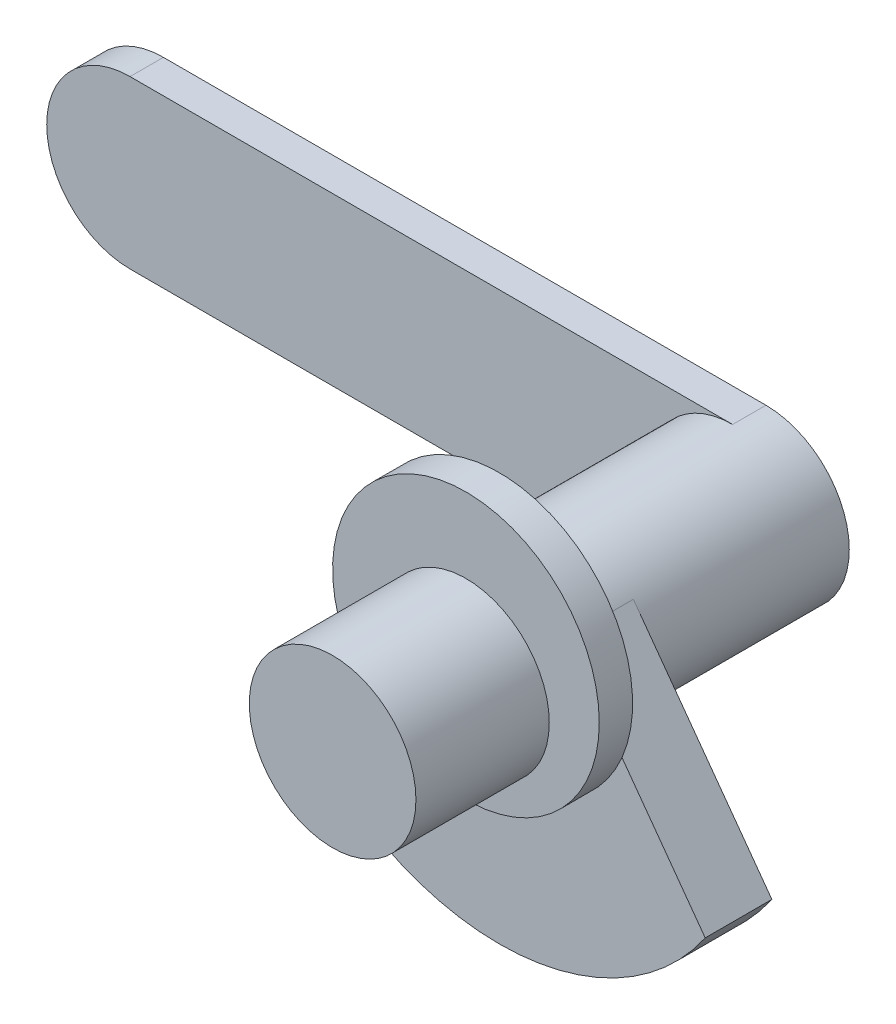
ISO-10303-21;
HEADER;
FILE_DESCRIPTION(('STEP AP214'),'2;1');
FILE_NAME('part.step','',(''),(''),'','','');
FILE_SCHEMA(('AUTOMOTIVE_DESIGN { 1 0 10303 214 1 1 1 1 }'));
ENDSEC;
DATA;
#1=APPLICATION_CONTEXT('core data for automotive mechanical design processes');
#2=APPLICATION_PROTOCOL_DEFINITION('international standard','automotive_design',2000,#1);
#3=PRODUCT_CONTEXT('',#1,'mechanical');
#4=PRODUCT('Part','Part','',(#3));
#5=PRODUCT_RELATED_PRODUCT_CATEGORY('part','',(#4));
#6=PRODUCT_DEFINITION_FORMATION('','',#4);
#7=PRODUCT_DEFINITION_CONTEXT('part definition',#1,'design');
#8=PRODUCT_DEFINITION('design','',#6,#7);
#9=PRODUCT_DEFINITION_SHAPE('','',#8);
#10=(LENGTH_UNIT() NAMED_UNIT(*) SI_UNIT(.MILLI.,.METRE.));
#11=(NAMED_UNIT(*) PLANE_ANGLE_UNIT() SI_UNIT($,.RADIAN.));
#12=(NAMED_UNIT(*) SI_UNIT($,.STERADIAN.) SOLID_ANGLE_UNIT());
#13=UNCERTAINTY_MEASURE_WITH_UNIT(LENGTH_MEASURE(1.E-05),#10,'distance_accuracy_value','');
#14=(GEOMETRIC_REPRESENTATION_CONTEXT(3) GLOBAL_UNCERTAINTY_ASSIGNED_CONTEXT((#13)) GLOBAL_UNIT_ASSIGNED_CONTEXT((#10,
#11,#12)) REPRESENTATION_CONTEXT('',''));
#15=CARTESIAN_POINT('',(0.,0.,0.));
#16=DIRECTION('',(0.,0.,1.));
#17=DIRECTION('',(1.,0.,0.));
#18=AXIS2_PLACEMENT_3D('',#15,#16,#17);
#19=CARTESIAN_POINT('',(0.,0.,25.4));
#20=DIRECTION('',(0.,0.,-1.));
#21=DIRECTION('',(-1.,0.,0.));
#22=AXIS2_PLACEMENT_3D('',#19,#20,#21);
#23=PLANE('',#22);
#24=CARTESIAN_POINT('',(0.,0.,25.4));
#25=DIRECTION('',(0.,0.,1.));
#26=DIRECTION('',(1.,0.,0.));
#27=AXIS2_PLACEMENT_3D('',#24,#25,#26);
#28=CIRCLE('',#27,63.5);
#29=CARTESIAN_POINT('',(0.,63.5,25.4));
#30=VERTEX_POINT('',#29);
#31=CARTESIAN_POINT('',(0.,-63.5,25.4));
#32=VERTEX_POINT('',#31);
#33=EDGE_CURVE('E184',#30,#32,#28,.T.);
#34=ORIENTED_EDGE('',*,*,#33,.F.);
#35=DIRECTION('',(-1.,0.,0.));
#36=VECTOR('',#35,1.);
#37=CARTESIAN_POINT('',(0.,63.5,25.4));
#38=LINE('',#37,#36);
#39=CARTESIAN_POINT('',(-459.135608438131,63.5,25.4));
#40=VERTEX_POINT('',#39);
#41=EDGE_CURVE('E198',#30,#40,#38,.T.);
#42=ORIENTED_EDGE('',*,*,#41,.T.);
#43=CARTESIAN_POINT('',(-459.135608438131,0.,25.4));
#44=DIRECTION('',(0.,0.,1.));
#45=DIRECTION('',(1.,0.,0.));
#46=AXIS2_PLACEMENT_3D('',#43,#44,#45);
#47=CIRCLE('',#46,63.5);
#48=CARTESIAN_POINT('',(-459.135608438131,-63.5,25.4));
#49=VERTEX_POINT('',#48);
#50=EDGE_CURVE('E194',#40,#49,#47,.T.);
#51=ORIENTED_EDGE('',*,*,#50,.T.);
#52=DIRECTION('',(-1.,0.,0.));
#53=VECTOR('',#52,1.);
#54=CARTESIAN_POINT('',(0.,-63.5,25.4));
#55=LINE('',#54,#53);
#56=EDGE_CURVE('E190',#32,#49,#55,.T.);
#57=ORIENTED_EDGE('',*,*,#56,.F.);
#58=EDGE_LOOP('',(#34,#42,#51,#57));
#59=FACE_BOUND('',#58,.T.);
#60=ADVANCED_FACE('F45',(#59),#23,.F.);
#61=CARTESIAN_POINT('',(0.,0.,25.4));
#62=DIRECTION('',(0.,0.,-1.));
#63=DIRECTION('',(-1.,0.,0.));
#64=AXIS2_PLACEMENT_3D('',#61,#62,#63);
#65=CYLINDRICAL_SURFACE('',#64,63.5);
#66=CARTESIAN_POINT('',(0.,0.,0.));
#67=DIRECTION('',(0.,0.,-1.));
#68=DIRECTION('',(-1.,0.,0.));
#69=AXIS2_PLACEMENT_3D('',#66,#67,#68);
#70=CIRCLE('',#69,63.5);
#71=CARTESIAN_POINT('',(0.,63.5,0.));
#72=VERTEX_POINT('',#71);
#73=CARTESIAN_POINT('',(0.,-63.5,0.));
#74=VERTEX_POINT('',#73);
#75=EDGE_CURVE('E187',#72,#74,#70,.T.);
#76=ORIENTED_EDGE('',*,*,#75,.F.);
#77=DIRECTION('',(0.,0.,-1.));
#78=VECTOR('',#77,1.);
#79=CARTESIAN_POINT('',(0.,63.5,25.4));
#80=LINE('',#79,#78);
#81=EDGE_CURVE('E55',#30,#72,#80,.T.);
#82=ORIENTED_EDGE('',*,*,#81,.F.);
#83=ORIENTED_EDGE('',*,*,#33,.T.);
#84=DIRECTION('',(0.,0.,-1.));
#85=VECTOR('',#84,1.);
#86=CARTESIAN_POINT('',(0.,-63.5,25.4));
#87=LINE('',#86,#85);
#88=EDGE_CURVE('E49',#32,#74,#87,.T.);
#89=ORIENTED_EDGE('',*,*,#88,.T.);
#90=EDGE_LOOP('',(#76,#82,#83,#89));
#91=FACE_BOUND('',#90,.T.);
#92=CARTESIAN_POINT('',(0.,0.,152.4));
#93=DIRECTION('',(0.,0.,1.));
#94=DIRECTION('',(1.,0.,0.));
#95=AXIS2_PLACEMENT_3D('',#92,#93,#94);
#96=CIRCLE('',#95,63.5);
#97=CARTESIAN_POINT('',(-51.3725791428091,37.3243635205721,152.4));
#98=VERTEX_POINT('',#97);
#99=CARTESIAN_POINT('',(51.3725791428091,37.3243635205721,152.4));
#100=VERTEX_POINT('',#99);
#101=EDGE_CURVE('E71',#98,#100,#96,.T.);
#102=ORIENTED_EDGE('',*,*,#101,.F.);
#103=DIRECTION('',(0.,0.,-1.));
#104=VECTOR('',#103,1.);
#105=CARTESIAN_POINT('',(-51.3725791428091,37.3243635205721,203.2));
#106=LINE('',#105,#104);
#107=CARTESIAN_POINT('',(-51.3725791428091,37.3243635205721,203.2));
#108=VERTEX_POINT('',#107);
#109=EDGE_CURVE('E180',#108,#98,#106,.T.);
#110=ORIENTED_EDGE('',*,*,#109,.F.);
#111=CARTESIAN_POINT('',(0.,0.,203.2));
#112=DIRECTION('',(0.,0.,1.));
#113=DIRECTION('',(-1.,0.,0.));
#114=AXIS2_PLACEMENT_3D('',#111,#112,#113);
#115=CIRCLE('',#114,63.5);
#116=CARTESIAN_POINT('',(51.3725791428091,37.3243635205721,203.2));
#117=VERTEX_POINT('',#116);
#118=EDGE_CURVE('E155',#117,#108,#115,.T.);
#119=ORIENTED_EDGE('',*,*,#118,.F.);
#120=DIRECTION('',(0.,0.,-1.));
#121=VECTOR('',#120,1.);
#122=CARTESIAN_POINT('',(51.3725791428091,37.3243635205721,203.2));
#123=LINE('',#122,#121);
#124=EDGE_CURVE('E127',#117,#100,#123,.T.);
#125=ORIENTED_EDGE('',*,*,#124,.T.);
#126=EDGE_LOOP('',(#102,#110,#119,#125));
#127=FACE_BOUND('',#126,.T.);
#128=ADVANCED_FACE('F47',(#91,#127),#65,.T.);
#129=CARTESIAN_POINT('',(0.,63.5,25.4));
#130=DIRECTION('',(0.,-1.,0.));
#131=DIRECTION('',(0.,0.,-1.));
#132=AXIS2_PLACEMENT_3D('',#129,#130,#131);
#133=PLANE('',#132);
#134=DIRECTION('',(-1.,0.,0.));
#135=VECTOR('',#134,1.);
#136=CARTESIAN_POINT('',(0.,63.5,0.));
#137=LINE('',#136,#135);
#138=CARTESIAN_POINT('',(-459.135608438131,63.5,0.));
#139=VERTEX_POINT('',#138);
#140=EDGE_CURVE('E195',#72,#139,#137,.T.);
#141=ORIENTED_EDGE('',*,*,#140,.T.);
#142=DIRECTION('',(0.,0.,-1.));
#143=VECTOR('',#142,1.);
#144=CARTESIAN_POINT('',(-459.135608438131,63.5,25.4));
#145=LINE('',#144,#143);
#146=EDGE_CURVE('E216',#40,#139,#145,.T.);
#147=ORIENTED_EDGE('',*,*,#146,.F.);
#148=ORIENTED_EDGE('',*,*,#41,.F.);
#149=ORIENTED_EDGE('',*,*,#81,.T.);
#150=EDGE_LOOP('',(#141,#147,#148,#149));
#151=FACE_BOUND('',#150,.T.);
#152=ADVANCED_FACE('F237',(#151),#133,.F.);
#153=CARTESIAN_POINT('',(-459.135608438131,0.,25.4));
#154=DIRECTION('',(0.,0.,-1.));
#155=DIRECTION('',(-1.,0.,0.));
#156=AXIS2_PLACEMENT_3D('',#153,#154,#155);
#157=CYLINDRICAL_SURFACE('',#156,63.5);
#158=CARTESIAN_POINT('',(-459.135608438131,0.,0.));
#159=DIRECTION('',(0.,0.,1.));
#160=DIRECTION('',(1.,0.,0.));
#161=AXIS2_PLACEMENT_3D('',#158,#159,#160);
#162=CIRCLE('',#161,63.5);
#163=CARTESIAN_POINT('',(-459.135608438131,-63.5,0.));
#164=VERTEX_POINT('',#163);
#165=EDGE_CURVE('E208',#139,#164,#162,.T.);
#166=ORIENTED_EDGE('',*,*,#165,.T.);
#167=DIRECTION('',(0.,0.,-1.));
#168=VECTOR('',#167,1.);
#169=CARTESIAN_POINT('',(-459.135608438131,-63.5,25.4));
#170=LINE('',#169,#168);
#171=EDGE_CURVE('E219',#49,#164,#170,.T.);
#172=ORIENTED_EDGE('',*,*,#171,.F.);
#173=ORIENTED_EDGE('',*,*,#50,.F.);
#174=ORIENTED_EDGE('',*,*,#146,.T.);
#175=EDGE_LOOP('',(#166,#172,#173,#174));
#176=FACE_BOUND('',#175,.T.);
#177=ADVANCED_FACE('F241',(#176),#157,.T.);
#178=CARTESIAN_POINT('',(0.,-63.5,25.4));
#179=DIRECTION('',(0.,-1.,0.));
#180=DIRECTION('',(0.,0.,-1.));
#181=AXIS2_PLACEMENT_3D('',#178,#179,#180);
#182=PLANE('',#181);
#183=DIRECTION('',(-1.,0.,0.));
#184=VECTOR('',#183,1.);
#185=CARTESIAN_POINT('',(0.,-63.5,0.));
#186=LINE('',#185,#184);
#187=EDGE_CURVE('E204',#74,#164,#186,.T.);
#188=ORIENTED_EDGE('',*,*,#187,.F.);
#189=ORIENTED_EDGE('',*,*,#88,.F.);
#190=ORIENTED_EDGE('',*,*,#56,.T.);
#191=ORIENTED_EDGE('',*,*,#171,.T.);
#192=EDGE_LOOP('',(#188,#189,#190,#191));
#193=FACE_BOUND('',#192,.T.);
#194=ADVANCED_FACE('F230',(#193),#182,.T.);
#195=CARTESIAN_POINT('',(0.,0.,0.));
#196=DIRECTION('',(0.,0.,-1.));
#197=DIRECTION('',(-1.,0.,0.));
#198=AXIS2_PLACEMENT_3D('',#195,#196,#197);
#199=PLANE('',#198);
#200=ORIENTED_EDGE('',*,*,#75,.T.);
#201=ORIENTED_EDGE('',*,*,#187,.T.);
#202=ORIENTED_EDGE('',*,*,#165,.F.);
#203=ORIENTED_EDGE('',*,*,#140,.F.);
#204=EDGE_LOOP('',(#200,#201,#202,#203));
#205=FACE_BOUND('',#204,.T.);
#206=ADVANCED_FACE('F234',(#205),#199,.T.);
#207=CARTESIAN_POINT('',(-51.3725791428091,37.3243635205721,203.2));
#208=DIRECTION('',(0.809016994374946,-0.587785252292474,0.));
#209=DIRECTION('',(0.587785252292474,0.809016994374946,0.));
#210=AXIS2_PLACEMENT_3D('',#207,#208,#209);
#211=PLANE('',#210);
#212=DIRECTION('',(-0.587785252292474,-0.809016994374946,0.));
#213=VECTOR('',#212,1.);
#214=CARTESIAN_POINT('',(-51.3725791428091,37.3243635205721,152.4));
#215=LINE('',#214,#213);
#216=CARTESIAN_POINT('',(-156.920582469416,-107.95,152.4));
#217=VERTEX_POINT('',#216);
#218=EDGE_CURVE('E152',#98,#217,#215,.T.);
#219=ORIENTED_EDGE('',*,*,#218,.T.);
#220=DIRECTION('',(0.,0.,-1.));
#221=VECTOR('',#220,1.);
#222=CARTESIAN_POINT('',(-156.920582469416,-107.95,203.2));
#223=LINE('',#222,#221);
#224=CARTESIAN_POINT('',(-156.920582469416,-107.95,203.2));
#225=VERTEX_POINT('',#224);
#226=EDGE_CURVE('E176',#225,#217,#223,.T.);
#227=ORIENTED_EDGE('',*,*,#226,.F.);
#228=DIRECTION('',(-0.587785252292474,-0.809016994374946,0.));
#229=VECTOR('',#228,1.);
#230=CARTESIAN_POINT('',(-51.3725791428091,37.3243635205721,203.2));
#231=LINE('',#230,#229);
#232=CARTESIAN_POINT('',(-93.5118133035717,-20.6753165208026,203.2));
#233=VERTEX_POINT('',#232);
#234=EDGE_CURVE('E158',#233,#225,#231,.T.);
#235=ORIENTED_EDGE('',*,*,#234,.F.);
#236=EDGE_CURVE('E142',#108,#233,#231,.T.);
#237=ORIENTED_EDGE('',*,*,#236,.F.);
#238=ORIENTED_EDGE('',*,*,#109,.T.);
#239=EDGE_LOOP('',(#219,#227,#235,#237,#238));
#240=FACE_BOUND('',#239,.T.);
#241=ADVANCED_FACE('F252',(#240),#211,.F.);
#242=CARTESIAN_POINT('',(0.,0.0600958126569101,203.2));
#243=DIRECTION('',(0.,0.,-1.));
#244=DIRECTION('',(-1.,0.,0.));
#245=AXIS2_PLACEMENT_3D('',#242,#243,#244);
#246=CYLINDRICAL_SURFACE('',#245,190.5);
#247=CARTESIAN_POINT('',(0.,0.0600958126569101,152.4));
#248=DIRECTION('',(0.,0.,1.));
#249=DIRECTION('',(1.,0.,0.));
#250=AXIS2_PLACEMENT_3D('',#247,#248,#249);
#251=CIRCLE('',#250,190.5);
#252=CARTESIAN_POINT('',(156.920582469416,-107.95,152.4));
#253=VERTEX_POINT('',#252);
#254=EDGE_CURVE('E166',#217,#253,#251,.T.);
#255=ORIENTED_EDGE('',*,*,#254,.T.);
#256=DIRECTION('',(0.,0.,-1.));
#257=VECTOR('',#256,1.);
#258=CARTESIAN_POINT('',(156.920582469416,-107.95,203.2));
#259=LINE('',#258,#257);
#260=CARTESIAN_POINT('',(156.920582469416,-107.95,203.2));
#261=VERTEX_POINT('',#260);
#262=EDGE_CURVE('E173',#261,#253,#259,.T.);
#263=ORIENTED_EDGE('',*,*,#262,.F.);
#264=CARTESIAN_POINT('',(0.,0.0600958126569101,203.2));
#265=DIRECTION('',(0.,0.,1.));
#266=DIRECTION('',(1.,0.,0.));
#267=AXIS2_PLACEMENT_3D('',#264,#265,#266);
#268=CIRCLE('',#267,190.5);
#269=EDGE_CURVE('E122',#225,#261,#268,.T.);
#270=ORIENTED_EDGE('',*,*,#269,.F.);
#271=ORIENTED_EDGE('',*,*,#226,.T.);
#272=EDGE_LOOP('',(#255,#263,#270,#271));
#273=FACE_BOUND('',#272,.T.);
#274=ADVANCED_FACE('F268',(#273),#246,.T.);
#275=CARTESIAN_POINT('',(51.3725791428091,37.3243635205721,203.2));
#276=DIRECTION('',(-0.809016994374946,-0.587785252292474,0.));
#277=DIRECTION('',(0.587785252292474,-0.809016994374946,0.));
#278=AXIS2_PLACEMENT_3D('',#275,#276,#277);
#279=PLANE('',#278);
#280=DIRECTION('',(-0.587785252292474,0.809016994374946,0.));
#281=VECTOR('',#280,1.);
#282=CARTESIAN_POINT('',(51.3725791428091,37.3243635205721,152.4));
#283=LINE('',#282,#281);
#284=EDGE_CURVE('E159',#253,#100,#283,.T.);
#285=ORIENTED_EDGE('',*,*,#284,.T.);
#286=ORIENTED_EDGE('',*,*,#124,.F.);
#287=DIRECTION('',(-0.587785252292474,0.809016994374946,0.));
#288=VECTOR('',#287,1.);
#289=CARTESIAN_POINT('',(51.3725791428091,37.3243635205721,203.2));
#290=LINE('',#289,#288);
#291=CARTESIAN_POINT('',(93.5118133035717,-20.6753165208026,203.2));
#292=VERTEX_POINT('',#291);
#293=EDGE_CURVE('E128',#292,#117,#290,.T.);
#294=ORIENTED_EDGE('',*,*,#293,.F.);
#295=EDGE_CURVE('E118',#261,#292,#290,.T.);
#296=ORIENTED_EDGE('',*,*,#295,.F.);
#297=ORIENTED_EDGE('',*,*,#262,.T.);
#298=EDGE_LOOP('',(#285,#286,#294,#296,#297));
#299=FACE_BOUND('',#298,.T.);
#300=ADVANCED_FACE('F133',(#299),#279,.F.);
#301=CARTESIAN_POINT('',(0.,0.,203.2));
#302=DIRECTION('',(0.,0.,-1.));
#303=DIRECTION('',(-1.,0.,0.));
#304=AXIS2_PLACEMENT_3D('',#301,#302,#303);
#305=PLANE('',#304);
#306=CARTESIAN_POINT('',(0.,19.05,203.2));
#307=DIRECTION('',(0.,0.,1.));
#308=DIRECTION('',(1.,0.,0.));
#309=AXIS2_PLACEMENT_3D('',#306,#307,#308);
#310=CIRCLE('',#309,101.6);
#311=EDGE_CURVE('E63',#233,#292,#310,.T.);
#312=ORIENTED_EDGE('',*,*,#311,.F.);
#313=ORIENTED_EDGE('',*,*,#234,.T.);
#314=ORIENTED_EDGE('',*,*,#269,.T.);
#315=ORIENTED_EDGE('',*,*,#295,.T.);
#316=EDGE_LOOP('',(#312,#313,#314,#315));
#317=FACE_BOUND('',#316,.T.);
#318=ADVANCED_FACE('F120',(#317),#305,.F.);
#319=CARTESIAN_POINT('',(0.,0.,152.4));
#320=DIRECTION('',(0.,0.,-1.));
#321=DIRECTION('',(-1.,0.,0.));
#322=AXIS2_PLACEMENT_3D('',#319,#320,#321);
#323=PLANE('',#322);
#324=ORIENTED_EDGE('',*,*,#218,.F.);
#325=ORIENTED_EDGE('',*,*,#101,.T.);
#326=ORIENTED_EDGE('',*,*,#284,.F.);
#327=ORIENTED_EDGE('',*,*,#254,.F.);
#328=EDGE_LOOP('',(#324,#325,#326,#327));
#329=FACE_BOUND('',#328,.T.);
#330=ADVANCED_FACE('F278',(#329),#323,.T.);
#331=CARTESIAN_POINT('',(0.,19.05,203.2));
#332=DIRECTION('',(0.,0.,1.));
#333=DIRECTION('',(1.,0.,0.));
#334=AXIS2_PLACEMENT_3D('',#331,#332,#333);
#335=PLANE('',#334);
#336=ORIENTED_EDGE('',*,*,#118,.T.);
#337=ORIENTED_EDGE('',*,*,#236,.T.);
#338=EDGE_CURVE('E140',#292,#233,#310,.T.);
#339=ORIENTED_EDGE('',*,*,#338,.F.);
#340=ORIENTED_EDGE('',*,*,#293,.T.);
#341=EDGE_LOOP('',(#336,#337,#339,#340));
#342=FACE_BOUND('',#341,.T.);
#343=ADVANCED_FACE('F141',(#342),#335,.F.);
#344=CARTESIAN_POINT('',(0.,19.05,228.6));
#345=DIRECTION('',(0.,0.,-1.));
#346=DIRECTION('',(-1.,0.,0.));
#347=AXIS2_PLACEMENT_3D('',#344,#345,#346);
#348=CYLINDRICAL_SURFACE('',#347,101.6);
#349=CARTESIAN_POINT('',(0.,19.05,228.6));
#350=DIRECTION('',(0.,0.,1.));
#351=DIRECTION('',(1.,0.,0.));
#352=AXIS2_PLACEMENT_3D('',#349,#350,#351);
#353=CIRCLE('',#352,101.6);
#354=CARTESIAN_POINT('',(101.6,19.05,228.6));
#355=VERTEX_POINT('',#354);
#356=EDGE_CURVE('E149',#355,#355,#353,.T.);
#357=ORIENTED_EDGE('',*,*,#356,.F.);
#358=EDGE_LOOP('',(#357));
#359=FACE_BOUND('',#358,.T.);
#360=ORIENTED_EDGE('',*,*,#311,.T.);
#361=ORIENTED_EDGE('',*,*,#338,.T.);
#362=EDGE_LOOP('',(#360,#361));
#363=FACE_BOUND('',#362,.T.);
#364=ADVANCED_FACE('F147',(#359,#363),#348,.T.);
#365=CARTESIAN_POINT('',(0.,19.05,228.6));
#366=DIRECTION('',(0.,0.,1.));
#367=DIRECTION('',(1.,0.,0.));
#368=AXIS2_PLACEMENT_3D('',#365,#366,#367);
#369=PLANE('',#368);
#370=CARTESIAN_POINT('',(0.,0.,228.6));
#371=DIRECTION('',(0.,0.,1.));
#372=DIRECTION('',(1.,0.,0.));
#373=AXIS2_PLACEMENT_3D('',#370,#371,#372);
#374=CIRCLE('',#373,63.5);
#375=CARTESIAN_POINT('',(63.5,0.,228.6));
#376=VERTEX_POINT('',#375);
#377=EDGE_CURVE('E11',#376,#376,#374,.T.);
#378=ORIENTED_EDGE('',*,*,#377,.F.);
#379=EDGE_LOOP('',(#378));
#380=FACE_BOUND('',#379,.T.);
#381=ORIENTED_EDGE('',*,*,#356,.T.);
#382=EDGE_LOOP('',(#381));
#383=FACE_BOUND('',#382,.T.);
#384=ADVANCED_FACE('F321',(#380,#383),#369,.T.);
#385=CARTESIAN_POINT('',(0.,0.,330.2));
#386=DIRECTION('',(0.,0.,-1.));
#387=DIRECTION('',(-1.,0.,0.));
#388=AXIS2_PLACEMENT_3D('',#385,#386,#387);
#389=CYLINDRICAL_SURFACE('',#388,63.5);
#390=CARTESIAN_POINT('',(0.,0.,330.2));
#391=DIRECTION('',(0.,0.,1.));
#392=DIRECTION('',(1.,0.,0.));
#393=AXIS2_PLACEMENT_3D('',#390,#391,#392);
#394=CIRCLE('',#393,63.5);
#395=CARTESIAN_POINT('',(63.5,0.,330.2));
#396=VERTEX_POINT('',#395);
#397=EDGE_CURVE('E145',#396,#396,#394,.T.);
#398=ORIENTED_EDGE('',*,*,#397,.F.);
#399=EDGE_LOOP('',(#398));
#400=FACE_BOUND('',#399,.T.);
#401=ORIENTED_EDGE('',*,*,#377,.T.);
#402=EDGE_LOOP('',(#401));
#403=FACE_BOUND('',#402,.T.);
#404=ADVANCED_FACE('F330',(#400,#403),#389,.T.);
#405=CARTESIAN_POINT('',(0.,0.,330.2));
#406=DIRECTION('',(0.,0.,1.));
#407=DIRECTION('',(1.,0.,0.));
#408=AXIS2_PLACEMENT_3D('',#405,#406,#407);
#409=PLANE('',#408);
#410=ORIENTED_EDGE('',*,*,#397,.T.);
#411=EDGE_LOOP('',(#410));
#412=FACE_BOUND('',#411,.T.);
#413=ADVANCED_FACE('F339',(#412),#409,.T.);
#414=CLOSED_SHELL('',(#60,#128,#152,#177,#194,#206,#241,#274,#300,#318,#330,#343,#364,#384,#404,#413));
#415=MANIFOLD_SOLID_BREP('B2',#414);
#416=ADVANCED_BREP_SHAPE_REPRESENTATION('',(#18,#415),#14);
#417=SHAPE_DEFINITION_REPRESENTATION(#9,#416);
ENDSEC;
END-ISO-10303-21;
